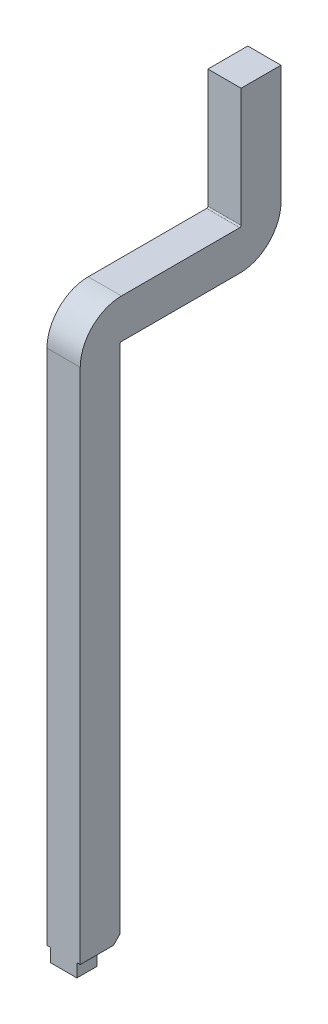
ISO-10303-21;
HEADER;
FILE_DESCRIPTION(('STEP AP214'),'2;1');
FILE_NAME('part.step','',(''),(''),'','','');
FILE_SCHEMA(('AUTOMOTIVE_DESIGN { 1 0 10303 214 1 1 1 1 }'));
ENDSEC;
DATA;
#1=APPLICATION_CONTEXT('core data for automotive mechanical design processes');
#2=APPLICATION_PROTOCOL_DEFINITION('international standard','automotive_design',2000,#1);
#3=PRODUCT_CONTEXT('',#1,'mechanical');
#4=PRODUCT('Part','Part','',(#3));
#5=PRODUCT_RELATED_PRODUCT_CATEGORY('part','',(#4));
#6=PRODUCT_DEFINITION_FORMATION('','',#4);
#7=PRODUCT_DEFINITION_CONTEXT('part definition',#1,'design');
#8=PRODUCT_DEFINITION('design','',#6,#7);
#9=PRODUCT_DEFINITION_SHAPE('','',#8);
#10=(LENGTH_UNIT() NAMED_UNIT(*) SI_UNIT(.MILLI.,.METRE.));
#11=(NAMED_UNIT(*) PLANE_ANGLE_UNIT() SI_UNIT($,.RADIAN.));
#12=(NAMED_UNIT(*) SI_UNIT($,.STERADIAN.) SOLID_ANGLE_UNIT());
#13=UNCERTAINTY_MEASURE_WITH_UNIT(LENGTH_MEASURE(1.E-05),#10,'distance_accuracy_value','');
#14=(GEOMETRIC_REPRESENTATION_CONTEXT(3) GLOBAL_UNCERTAINTY_ASSIGNED_CONTEXT((#13)) GLOBAL_UNIT_ASSIGNED_CONTEXT((#10,
#11,#12)) REPRESENTATION_CONTEXT('',''));
#15=CARTESIAN_POINT('',(0.,0.,0.));
#16=DIRECTION('',(0.,0.,1.));
#17=DIRECTION('',(1.,0.,0.));
#18=AXIS2_PLACEMENT_3D('',#15,#16,#17);
#19=CARTESIAN_POINT('',(0.,-2.04656537194598,0.));
#20=DIRECTION('',(0.,-1.,0.));
#21=DIRECTION('',(0.,0.,-1.));
#22=AXIS2_PLACEMENT_3D('',#19,#20,#21);
#23=PLANE('',#22);
#24=DIRECTION('',(1.,0.,0.));
#25=VECTOR('',#24,1.);
#26=CARTESIAN_POINT('',(-0.1,-2.04656537194598,0.604999999999999));
#27=LINE('',#26,#25);
#28=CARTESIAN_POINT('',(-0.1,-2.04656537194598,0.604999999999999));
#29=VERTEX_POINT('',#28);
#30=CARTESIAN_POINT('',(0.1,-2.04656537194598,0.604999999999999));
#31=VERTEX_POINT('',#30);
#32=EDGE_CURVE('E215',#29,#31,#27,.T.);
#33=ORIENTED_EDGE('',*,*,#32,.T.);
#34=DIRECTION('',(0.,0.,1.));
#35=VECTOR('',#34,1.);
#36=CARTESIAN_POINT('',(0.1,-2.04656537194598,0.604999999999999));
#37=LINE('',#36,#35);
#38=CARTESIAN_POINT('',(0.1,-2.04656537194598,0.754999999999999));
#39=VERTEX_POINT('',#38);
#40=EDGE_CURVE('E212',#31,#39,#37,.T.);
#41=ORIENTED_EDGE('',*,*,#40,.T.);
#42=DIRECTION('',(1.,0.,0.));
#43=VECTOR('',#42,1.);
#44=CARTESIAN_POINT('',(0.125,-2.04656537194598,0.754999999999999));
#45=LINE('',#44,#43);
#46=CARTESIAN_POINT('',(-0.1,-2.04656537194598,0.754999999999999));
#47=VERTEX_POINT('',#46);
#48=EDGE_CURVE('E173',#47,#39,#45,.T.);
#49=ORIENTED_EDGE('',*,*,#48,.F.);
#50=DIRECTION('',(0.,0.,-1.));
#51=VECTOR('',#50,1.);
#52=CARTESIAN_POINT('',(-0.1,-2.04656537194598,0.754999999999999));
#53=LINE('',#52,#51);
#54=EDGE_CURVE('E225',#47,#29,#53,.T.);
#55=ORIENTED_EDGE('',*,*,#54,.T.);
#56=EDGE_LOOP('',(#33,#41,#49,#55));
#57=FACE_BOUND('',#56,.T.);
#58=ADVANCED_FACE('F16',(#57),#23,.T.);
#59=CARTESIAN_POINT('',(-0.125,1.94343462805402,0.444999999999999));
#60=DIRECTION('',(-1.,0.,0.));
#61=DIRECTION('',(0.,0.,1.));
#62=AXIS2_PLACEMENT_3D('',#59,#60,#61);
#63=PLANE('',#62);
#64=DIRECTION('',(0.,0.,-1.));
#65=VECTOR('',#64,1.);
#66=CARTESIAN_POINT('',(-0.125,1.95656537194598,-0.445000000000001));
#67=LINE('',#66,#65);
#68=CARTESIAN_POINT('',(-0.125,1.95656537194598,0.445000000000001));
#69=VERTEX_POINT('',#68);
#70=CARTESIAN_POINT('',(-0.125,1.95656537194598,-0.445000000000001));
#71=VERTEX_POINT('',#70);
#72=EDGE_CURVE('E190',#69,#71,#67,.T.);
#73=ORIENTED_EDGE('',*,*,#72,.F.);
#74=CARTESIAN_POINT('',(-0.125,1.94656537194598,0.445000000000001));
#75=DIRECTION('',(-1.,0.,0.));
#76=DIRECTION('',(0.,0.,1.));
#77=AXIS2_PLACEMENT_3D('',#74,#75,#76);
#78=CIRCLE('',#77,0.01);
#79=CARTESIAN_POINT('',(-0.125,1.94656537194598,0.454999999999999));
#80=VERTEX_POINT('',#79);
#81=EDGE_CURVE('E183',#69,#80,#78,.F.);
#82=ORIENTED_EDGE('',*,*,#81,.T.);
#83=DIRECTION('',(0.,1.,0.));
#84=VECTOR('',#83,1.);
#85=CARTESIAN_POINT('',(-0.125,1.94656537194598,0.454999999999999));
#86=LINE('',#85,#84);
#87=CARTESIAN_POINT('',(-0.125,-1.89656537194598,0.455));
#88=VERTEX_POINT('',#87);
#89=EDGE_CURVE('E180',#88,#80,#86,.T.);
#90=ORIENTED_EDGE('',*,*,#89,.F.);
#91=DIRECTION('',(0.,-0.707106781186548,0.707106781186547));
#92=VECTOR('',#91,1.);
#93=CARTESIAN_POINT('',(-0.125,-1.89656537194598,0.454999999999999));
#94=LINE('',#93,#92);
#95=CARTESIAN_POINT('',(-0.125,-1.94656537194598,0.504999999999999));
#96=VERTEX_POINT('',#95);
#97=EDGE_CURVE('E186',#88,#96,#94,.T.);
#98=ORIENTED_EDGE('',*,*,#97,.T.);
#99=DIRECTION('',(0.,0.,1.));
#100=VECTOR('',#99,1.);
#101=CARTESIAN_POINT('',(-0.125,-1.94656537194598,0.444999999999999));
#102=LINE('',#101,#100);
#103=CARTESIAN_POINT('',(-0.125,-1.94656537194598,0.754999999999999));
#104=VERTEX_POINT('',#103);
#105=EDGE_CURVE('E148',#96,#104,#102,.T.);
#106=ORIENTED_EDGE('',*,*,#105,.T.);
#107=DIRECTION('',(0.,-1.,0.));
#108=VECTOR('',#107,1.);
#109=CARTESIAN_POINT('',(-0.125,-1.94656537194598,0.754999999999999));
#110=LINE('',#109,#108);
#111=CARTESIAN_POINT('',(-0.125,1.94343462805402,0.754999999999999));
#112=VERTEX_POINT('',#111);
#113=EDGE_CURVE('E146',#112,#104,#110,.T.);
#114=ORIENTED_EDGE('',*,*,#113,.F.);
#115=CARTESIAN_POINT('',(-0.125,1.94343462805402,0.444999999999999));
#116=DIRECTION('',(-1.,0.,0.));
#117=DIRECTION('',(0.,0.,1.));
#118=AXIS2_PLACEMENT_3D('',#115,#116,#117);
#119=CIRCLE('',#118,0.31);
#120=CARTESIAN_POINT('',(-0.125,2.25343462805402,0.444999999999999));
#121=VERTEX_POINT('',#120);
#122=EDGE_CURVE('E19',#121,#112,#119,.F.);
#123=ORIENTED_EDGE('',*,*,#122,.F.);
#124=DIRECTION('',(0.,0.,1.));
#125=VECTOR('',#124,1.);
#126=CARTESIAN_POINT('',(-0.125,2.25343462805402,0.444999999999999));
#127=LINE('',#126,#125);
#128=CARTESIAN_POINT('',(-0.125,2.25343462805402,-0.445000000000001));
#129=VERTEX_POINT('',#128);
#130=EDGE_CURVE('E131',#129,#121,#127,.T.);
#131=ORIENTED_EDGE('',*,*,#130,.F.);
#132=CARTESIAN_POINT('',(-0.125,2.26343462805402,-0.445000000000001));
#133=DIRECTION('',(-1.,0.,0.));
#134=DIRECTION('',(0.,0.,1.));
#135=AXIS2_PLACEMENT_3D('',#132,#133,#134);
#136=CIRCLE('',#135,0.01);
#137=CARTESIAN_POINT('',(-0.125,2.26343462805402,-0.454999999999998));
#138=VERTEX_POINT('',#137);
#139=EDGE_CURVE('E207',#129,#138,#136,.F.);
#140=ORIENTED_EDGE('',*,*,#139,.T.);
#141=DIRECTION('',(0.,1.,0.));
#142=VECTOR('',#141,1.);
#143=CARTESIAN_POINT('',(-0.125,2.26343462805402,-0.454999999999998));
#144=LINE('',#143,#142);
#145=CARTESIAN_POINT('',(-0.125,3.15656537194598,-0.454999999999998));
#146=VERTEX_POINT('',#145);
#147=EDGE_CURVE('E205',#146,#138,#144,.F.);
#148=ORIENTED_EDGE('',*,*,#147,.F.);
#149=DIRECTION('',(0.,0.,1.));
#150=VECTOR('',#149,1.);
#151=CARTESIAN_POINT('',(-0.125,3.15656537194598,-0.454999999999998));
#152=LINE('',#151,#150);
#153=CARTESIAN_POINT('',(-0.125,3.15656537194598,-0.754999999999998));
#154=VERTEX_POINT('',#153);
#155=EDGE_CURVE('E200',#154,#146,#152,.T.);
#156=ORIENTED_EDGE('',*,*,#155,.F.);
#157=DIRECTION('',(0.,1.,0.));
#158=VECTOR('',#157,1.);
#159=CARTESIAN_POINT('',(-0.125,3.15656537194598,-0.754999999999998));
#160=LINE('',#159,#158);
#161=CARTESIAN_POINT('',(-0.125,2.26656537194598,-0.754999999999999));
#162=VERTEX_POINT('',#161);
#163=EDGE_CURVE('E194',#162,#154,#160,.T.);
#164=ORIENTED_EDGE('',*,*,#163,.F.);
#165=CARTESIAN_POINT('',(-0.125,2.26656537194598,-0.445000000000001));
#166=DIRECTION('',(-1.,0.,0.));
#167=DIRECTION('',(0.,0.,1.));
#168=AXIS2_PLACEMENT_3D('',#165,#166,#167);
#169=CIRCLE('',#168,0.31);
#170=EDGE_CURVE('E277',#71,#162,#169,.F.);
#171=ORIENTED_EDGE('',*,*,#170,.F.);
#172=EDGE_LOOP('',(#73,#82,#90,#98,#106,#114,#123,#131,#140,#148,#156,#164,#171));
#173=FACE_BOUND('',#172,.T.);
#174=ADVANCED_FACE('F147',(#173),#63,.T.);
#175=CARTESIAN_POINT('',(0.1,-2.04656537194598,0.604999999999999));
#176=DIRECTION('',(-1.,0.,0.));
#177=DIRECTION('',(0.,0.,1.));
#178=AXIS2_PLACEMENT_3D('',#175,#176,#177);
#179=PLANE('',#178);
#180=DIRECTION('',(0.,-1.,0.));
#181=VECTOR('',#180,1.);
#182=CARTESIAN_POINT('',(0.1,-1.94656537194598,0.754999999999999));
#183=LINE('',#182,#181);
#184=CARTESIAN_POINT('',(0.1,-1.94656537194598,0.754999999999999));
#185=VERTEX_POINT('',#184);
#186=EDGE_CURVE('E144',#39,#185,#183,.F.);
#187=ORIENTED_EDGE('',*,*,#186,.F.);
#188=ORIENTED_EDGE('',*,*,#40,.F.);
#189=DIRECTION('',(0.,-1.,0.));
#190=VECTOR('',#189,1.);
#191=CARTESIAN_POINT('',(0.1,-2.04656537194598,0.604999999999999));
#192=LINE('',#191,#190);
#193=CARTESIAN_POINT('',(0.1,-1.94656537194598,0.604999999999999));
#194=VERTEX_POINT('',#193);
#195=EDGE_CURVE('E228',#31,#194,#192,.F.);
#196=ORIENTED_EDGE('',*,*,#195,.T.);
#197=DIRECTION('',(0.,0.,-1.));
#198=VECTOR('',#197,1.);
#199=CARTESIAN_POINT('',(0.1,-1.94656537194598,0.454999999999999));
#200=LINE('',#199,#198);
#201=EDGE_CURVE('E167',#185,#194,#200,.T.);
#202=ORIENTED_EDGE('',*,*,#201,.F.);
#203=EDGE_LOOP('',(#187,#188,#196,#202));
#204=FACE_BOUND('',#203,.T.);
#205=ADVANCED_FACE('F502',(#204),#179,.F.);
#206=CARTESIAN_POINT('',(-0.1,-2.04656537194598,0.604999999999999));
#207=DIRECTION('',(0.,0.,1.));
#208=DIRECTION('',(0.,-1.,0.));
#209=AXIS2_PLACEMENT_3D('',#206,#207,#208);
#210=PLANE('',#209);
#211=ORIENTED_EDGE('',*,*,#195,.F.);
#212=ORIENTED_EDGE('',*,*,#32,.F.);
#213=DIRECTION('',(0.,1.,0.));
#214=VECTOR('',#213,1.);
#215=CARTESIAN_POINT('',(-0.1,-2.04656537194598,0.604999999999999));
#216=LINE('',#215,#214);
#217=CARTESIAN_POINT('',(-0.1,-1.94656537194598,0.604999999999999));
#218=VERTEX_POINT('',#217);
#219=EDGE_CURVE('E153',#29,#218,#216,.T.);
#220=ORIENTED_EDGE('',*,*,#219,.T.);
#221=DIRECTION('',(1.,0.,0.));
#222=VECTOR('',#221,1.);
#223=CARTESIAN_POINT('',(0.125,-1.94656537194598,0.604999999999999));
#224=LINE('',#223,#222);
#225=EDGE_CURVE('E177',#194,#218,#224,.F.);
#226=ORIENTED_EDGE('',*,*,#225,.F.);
#227=EDGE_LOOP('',(#211,#212,#220,#226));
#228=FACE_BOUND('',#227,.T.);
#229=ADVANCED_FACE('F493',(#228),#210,.F.);
#230=CARTESIAN_POINT('',(-0.1,-2.04656537194598,0.754999999999999));
#231=DIRECTION('',(1.,0.,0.));
#232=DIRECTION('',(0.,0.,-1.));
#233=AXIS2_PLACEMENT_3D('',#230,#231,#232);
#234=PLANE('',#233);
#235=ORIENTED_EDGE('',*,*,#219,.F.);
#236=ORIENTED_EDGE('',*,*,#54,.F.);
#237=DIRECTION('',(0.,-1.,0.));
#238=VECTOR('',#237,1.);
#239=CARTESIAN_POINT('',(-0.1,-1.94656537194598,0.754999999999999));
#240=LINE('',#239,#238);
#241=CARTESIAN_POINT('',(-0.1,-1.94656537194598,0.754999999999999));
#242=VERTEX_POINT('',#241);
#243=EDGE_CURVE('E152',#242,#47,#240,.T.);
#244=ORIENTED_EDGE('',*,*,#243,.F.);
#245=DIRECTION('',(0.,0.,-1.));
#246=VECTOR('',#245,1.);
#247=CARTESIAN_POINT('',(-0.1,-1.94656537194598,0.454999999999999));
#248=LINE('',#247,#246);
#249=EDGE_CURVE('E231',#218,#242,#248,.F.);
#250=ORIENTED_EDGE('',*,*,#249,.F.);
#251=EDGE_LOOP('',(#235,#236,#244,#250));
#252=FACE_BOUND('',#251,.T.);
#253=ADVANCED_FACE('F485',(#252),#234,.F.);
#254=CARTESIAN_POINT('',(0.125,-1.94656537194598,0.754999999999999));
#255=DIRECTION('',(0.,0.,1.));
#256=DIRECTION('',(0.,-1.,0.));
#257=AXIS2_PLACEMENT_3D('',#254,#255,#256);
#258=PLANE('',#257);
#259=DIRECTION('',(0.,1.,0.));
#260=VECTOR('',#259,1.);
#261=CARTESIAN_POINT('',(0.125,1.94343462805402,0.754999999999999));
#262=LINE('',#261,#260);
#263=CARTESIAN_POINT('',(0.125,-1.94656537194598,0.754999999999999));
#264=VERTEX_POINT('',#263);
#265=CARTESIAN_POINT('',(0.125,1.94343462805402,0.754999999999999));
#266=VERTEX_POINT('',#265);
#267=EDGE_CURVE('E158',#264,#266,#262,.T.);
#268=ORIENTED_EDGE('',*,*,#267,.T.);
#269=DIRECTION('',(-1.,0.,0.));
#270=VECTOR('',#269,1.);
#271=CARTESIAN_POINT('',(0.125,1.94343462805402,0.754999999999999));
#272=LINE('',#271,#270);
#273=EDGE_CURVE('E140',#112,#266,#272,.F.);
#274=ORIENTED_EDGE('',*,*,#273,.F.);
#275=ORIENTED_EDGE('',*,*,#113,.T.);
#276=DIRECTION('',(1.,0.,0.));
#277=VECTOR('',#276,1.);
#278=CARTESIAN_POINT('',(0.125,-1.94656537194598,0.754999999999999));
#279=LINE('',#278,#277);
#280=EDGE_CURVE('E233',#242,#104,#279,.F.);
#281=ORIENTED_EDGE('',*,*,#280,.F.);
#282=ORIENTED_EDGE('',*,*,#243,.T.);
#283=ORIENTED_EDGE('',*,*,#48,.T.);
#284=ORIENTED_EDGE('',*,*,#186,.T.);
#285=DIRECTION('',(1.,0.,0.));
#286=VECTOR('',#285,1.);
#287=CARTESIAN_POINT('',(0.125,-1.94656537194598,0.754999999999999));
#288=LINE('',#287,#286);
#289=EDGE_CURVE('E164',#264,#185,#288,.F.);
#290=ORIENTED_EDGE('',*,*,#289,.F.);
#291=EDGE_LOOP('',(#268,#274,#275,#281,#282,#283,#284,#290));
#292=FACE_BOUND('',#291,.T.);
#293=ADVANCED_FACE('F156',(#292),#258,.T.);
#294=CARTESIAN_POINT('',(0.125,1.94343462805402,0.444999999999999));
#295=DIRECTION('',(-1.,0.,0.));
#296=DIRECTION('',(0.,0.,1.));
#297=AXIS2_PLACEMENT_3D('',#294,#295,#296);
#298=CYLINDRICAL_SURFACE('',#297,0.31);
#299=CARTESIAN_POINT('',(0.125,1.94343462805402,0.444999999999999));
#300=DIRECTION('',(-1.,0.,0.));
#301=DIRECTION('',(0.,0.,1.));
#302=AXIS2_PLACEMENT_3D('',#299,#300,#301);
#303=CIRCLE('',#302,0.31);
#304=CARTESIAN_POINT('',(0.125,2.25343462805402,0.444999999999999));
#305=VERTEX_POINT('',#304);
#306=EDGE_CURVE('E272',#266,#305,#303,.T.);
#307=ORIENTED_EDGE('',*,*,#306,.T.);
#308=DIRECTION('',(1.,0.,0.));
#309=VECTOR('',#308,1.);
#310=CARTESIAN_POINT('',(0.125,2.25343462805402,0.444999999999999));
#311=LINE('',#310,#309);
#312=EDGE_CURVE('E142',#121,#305,#311,.T.);
#313=ORIENTED_EDGE('',*,*,#312,.F.);
#314=ORIENTED_EDGE('',*,*,#122,.T.);
#315=ORIENTED_EDGE('',*,*,#273,.T.);
#316=EDGE_LOOP('',(#307,#313,#314,#315));
#317=FACE_BOUND('',#316,.T.);
#318=ADVANCED_FACE('F138',(#317),#298,.T.);
#319=CARTESIAN_POINT('',(0.125,2.25343462805402,0.444999999999999));
#320=DIRECTION('',(0.,1.,0.));
#321=DIRECTION('',(0.,0.,1.));
#322=AXIS2_PLACEMENT_3D('',#319,#320,#321);
#323=PLANE('',#322);
#324=DIRECTION('',(0.,0.,1.));
#325=VECTOR('',#324,1.);
#326=CARTESIAN_POINT('',(0.125,2.25343462805402,0.444999999999999));
#327=LINE('',#326,#325);
#328=CARTESIAN_POINT('',(0.125,2.25343462805402,-0.445000000000001));
#329=VERTEX_POINT('',#328);
#330=EDGE_CURVE('E271',#305,#329,#327,.F.);
#331=ORIENTED_EDGE('',*,*,#330,.T.);
#332=DIRECTION('',(-1.,0.,0.));
#333=VECTOR('',#332,1.);
#334=CARTESIAN_POINT('',(0.125,2.25343462805402,-0.445000000000001));
#335=LINE('',#334,#333);
#336=EDGE_CURVE('E279',#329,#129,#335,.T.);
#337=ORIENTED_EDGE('',*,*,#336,.T.);
#338=ORIENTED_EDGE('',*,*,#130,.T.);
#339=ORIENTED_EDGE('',*,*,#312,.T.);
#340=EDGE_LOOP('',(#331,#337,#338,#339));
#341=FACE_BOUND('',#340,.T.);
#342=ADVANCED_FACE('F366',(#341),#323,.T.);
#343=CARTESIAN_POINT('',(0.125,2.26343462805402,-0.445000000000001));
#344=DIRECTION('',(-1.,0.,0.));
#345=DIRECTION('',(0.,0.,1.));
#346=AXIS2_PLACEMENT_3D('',#343,#344,#345);
#347=CYLINDRICAL_SURFACE('',#346,0.01);
#348=ORIENTED_EDGE('',*,*,#336,.F.);
#349=CARTESIAN_POINT('',(0.125,2.26343462805402,-0.445000000000001));
#350=DIRECTION('',(-1.,0.,0.));
#351=DIRECTION('',(0.,0.,1.));
#352=AXIS2_PLACEMENT_3D('',#349,#350,#351);
#353=CIRCLE('',#352,0.01);
#354=CARTESIAN_POINT('',(0.125,2.26343462805402,-0.455));
#355=VERTEX_POINT('',#354);
#356=EDGE_CURVE('E267',#329,#355,#353,.F.);
#357=ORIENTED_EDGE('',*,*,#356,.T.);
#358=DIRECTION('',(1.,0.,0.));
#359=VECTOR('',#358,1.);
#360=CARTESIAN_POINT('',(0.125,2.26343462805402,-0.454999999999998));
#361=LINE('',#360,#359);
#362=EDGE_CURVE('E202',#138,#355,#361,.T.);
#363=ORIENTED_EDGE('',*,*,#362,.F.);
#364=ORIENTED_EDGE('',*,*,#139,.F.);
#365=EDGE_LOOP('',(#348,#357,#363,#364));
#366=FACE_BOUND('',#365,.T.);
#367=ADVANCED_FACE('F364',(#366),#347,.F.);
#368=CARTESIAN_POINT('',(0.125,2.26343462805402,-0.454999999999998));
#369=DIRECTION('',(0.,0.,1.));
#370=DIRECTION('',(1.,0.,0.));
#371=AXIS2_PLACEMENT_3D('',#368,#369,#370);
#372=PLANE('',#371);
#373=DIRECTION('',(0.,1.,0.));
#374=VECTOR('',#373,1.);
#375=CARTESIAN_POINT('',(0.125,1.94343462805402,-0.455000000000001));
#376=LINE('',#375,#374);
#377=CARTESIAN_POINT('',(0.125,3.15656537194598,-0.455));
#378=VERTEX_POINT('',#377);
#379=EDGE_CURVE('E270',#355,#378,#376,.T.);
#380=ORIENTED_EDGE('',*,*,#379,.T.);
#381=DIRECTION('',(1.,0.,0.));
#382=VECTOR('',#381,1.);
#383=CARTESIAN_POINT('',(0.125,3.15656537194598,-0.454999999999998));
#384=LINE('',#383,#382);
#385=EDGE_CURVE('E197',#146,#378,#384,.T.);
#386=ORIENTED_EDGE('',*,*,#385,.F.);
#387=ORIENTED_EDGE('',*,*,#147,.T.);
#388=ORIENTED_EDGE('',*,*,#362,.T.);
#389=EDGE_LOOP('',(#380,#386,#387,#388));
#390=FACE_BOUND('',#389,.T.);
#391=ADVANCED_FACE('F360',(#390),#372,.T.);
#392=CARTESIAN_POINT('',(0.125,3.15656537194598,-0.454999999999998));
#393=DIRECTION('',(0.,1.,0.));
#394=DIRECTION('',(0.,0.,1.));
#395=AXIS2_PLACEMENT_3D('',#392,#393,#394);
#396=PLANE('',#395);
#397=DIRECTION('',(0.,0.,1.));
#398=VECTOR('',#397,1.);
#399=CARTESIAN_POINT('',(0.125,3.15656537194598,0.444999999999999));
#400=LINE('',#399,#398);
#401=CARTESIAN_POINT('',(0.125,3.15656537194598,-0.754999999999998));
#402=VERTEX_POINT('',#401);
#403=EDGE_CURVE('E291',#378,#402,#400,.F.);
#404=ORIENTED_EDGE('',*,*,#403,.T.);
#405=DIRECTION('',(-1.,0.,0.));
#406=VECTOR('',#405,1.);
#407=CARTESIAN_POINT('',(0.125,3.15656537194598,-0.754999999999998));
#408=LINE('',#407,#406);
#409=EDGE_CURVE('E196',#154,#402,#408,.F.);
#410=ORIENTED_EDGE('',*,*,#409,.F.);
#411=ORIENTED_EDGE('',*,*,#155,.T.);
#412=ORIENTED_EDGE('',*,*,#385,.T.);
#413=EDGE_LOOP('',(#404,#410,#411,#412));
#414=FACE_BOUND('',#413,.T.);
#415=ADVANCED_FACE('F357',(#414),#396,.T.);
#416=CARTESIAN_POINT('',(0.125,3.15656537194598,-0.754999999999998));
#417=DIRECTION('',(0.,0.,-1.));
#418=DIRECTION('',(-1.,0.,0.));
#419=AXIS2_PLACEMENT_3D('',#416,#417,#418);
#420=PLANE('',#419);
#421=DIRECTION('',(0.,1.,0.));
#422=VECTOR('',#421,1.);
#423=CARTESIAN_POINT('',(0.125,1.94343462805402,-0.754999999999998));
#424=LINE('',#423,#422);
#425=CARTESIAN_POINT('',(0.125,2.26656537194598,-0.755));
#426=VERTEX_POINT('',#425);
#427=EDGE_CURVE('E266',#402,#426,#424,.F.);
#428=ORIENTED_EDGE('',*,*,#427,.T.);
#429=DIRECTION('',(-1.,0.,0.));
#430=VECTOR('',#429,1.);
#431=CARTESIAN_POINT('',(0.125,2.26656537194598,-0.755000000000001));
#432=LINE('',#431,#430);
#433=EDGE_CURVE('E193',#162,#426,#432,.F.);
#434=ORIENTED_EDGE('',*,*,#433,.F.);
#435=ORIENTED_EDGE('',*,*,#163,.T.);
#436=ORIENTED_EDGE('',*,*,#409,.T.);
#437=EDGE_LOOP('',(#428,#434,#435,#436));
#438=FACE_BOUND('',#437,.T.);
#439=ADVANCED_FACE('F351',(#438),#420,.T.);
#440=CARTESIAN_POINT('',(0.125,2.26656537194598,-0.445000000000001));
#441=DIRECTION('',(-1.,0.,0.));
#442=DIRECTION('',(0.,0.,1.));
#443=AXIS2_PLACEMENT_3D('',#440,#441,#442);
#444=CYLINDRICAL_SURFACE('',#443,0.31);
#445=CARTESIAN_POINT('',(0.125,2.26656537194598,-0.445000000000001));
#446=DIRECTION('',(-1.,0.,0.));
#447=DIRECTION('',(0.,0.,1.));
#448=AXIS2_PLACEMENT_3D('',#445,#446,#447);
#449=CIRCLE('',#448,0.31);
#450=CARTESIAN_POINT('',(0.125,1.95656537194598,-0.445000000000001));
#451=VERTEX_POINT('',#450);
#452=EDGE_CURVE('E263',#426,#451,#449,.T.);
#453=ORIENTED_EDGE('',*,*,#452,.T.);
#454=DIRECTION('',(1.,0.,0.));
#455=VECTOR('',#454,1.);
#456=CARTESIAN_POINT('',(0.125,1.95656537194598,-0.445000000000001));
#457=LINE('',#456,#455);
#458=EDGE_CURVE('E192',#71,#451,#457,.T.);
#459=ORIENTED_EDGE('',*,*,#458,.F.);
#460=ORIENTED_EDGE('',*,*,#170,.T.);
#461=ORIENTED_EDGE('',*,*,#433,.T.);
#462=EDGE_LOOP('',(#453,#459,#460,#461));
#463=FACE_BOUND('',#462,.T.);
#464=ADVANCED_FACE('F347',(#463),#444,.T.);
#465=CARTESIAN_POINT('',(0.125,1.95656537194598,-0.445000000000001));
#466=DIRECTION('',(0.,-1.,0.));
#467=DIRECTION('',(0.,0.,-1.));
#468=AXIS2_PLACEMENT_3D('',#465,#466,#467);
#469=PLANE('',#468);
#470=DIRECTION('',(0.,0.,1.));
#471=VECTOR('',#470,1.);
#472=CARTESIAN_POINT('',(0.125,1.95656537194598,0.444999999999999));
#473=LINE('',#472,#471);
#474=CARTESIAN_POINT('',(0.125,1.95656537194598,0.445000000000001));
#475=VERTEX_POINT('',#474);
#476=EDGE_CURVE('E262',#451,#475,#473,.T.);
#477=ORIENTED_EDGE('',*,*,#476,.T.);
#478=DIRECTION('',(-1.,0.,0.));
#479=VECTOR('',#478,1.);
#480=CARTESIAN_POINT('',(0.125,1.95656537194598,0.445000000000001));
#481=LINE('',#480,#479);
#482=EDGE_CURVE('E276',#475,#69,#481,.T.);
#483=ORIENTED_EDGE('',*,*,#482,.T.);
#484=ORIENTED_EDGE('',*,*,#72,.T.);
#485=ORIENTED_EDGE('',*,*,#458,.T.);
#486=EDGE_LOOP('',(#477,#483,#484,#485));
#487=FACE_BOUND('',#486,.T.);
#488=ADVANCED_FACE('F341',(#487),#469,.T.);
#489=CARTESIAN_POINT('',(0.125,1.94656537194598,0.445000000000001));
#490=DIRECTION('',(-1.,0.,0.));
#491=DIRECTION('',(0.,0.,1.));
#492=AXIS2_PLACEMENT_3D('',#489,#490,#491);
#493=CYLINDRICAL_SURFACE('',#492,0.01);
#494=ORIENTED_EDGE('',*,*,#482,.F.);
#495=CARTESIAN_POINT('',(0.125,1.94656537194598,0.445000000000001));
#496=DIRECTION('',(-1.,0.,0.));
#497=DIRECTION('',(0.,0.,1.));
#498=AXIS2_PLACEMENT_3D('',#495,#496,#497);
#499=CIRCLE('',#498,0.01);
#500=CARTESIAN_POINT('',(0.125,1.94656537194598,0.455));
#501=VERTEX_POINT('',#500);
#502=EDGE_CURVE('E258',#475,#501,#499,.F.);
#503=ORIENTED_EDGE('',*,*,#502,.T.);
#504=DIRECTION('',(-1.,0.,0.));
#505=VECTOR('',#504,1.);
#506=CARTESIAN_POINT('',(0.125,1.94656537194598,0.454999999999999));
#507=LINE('',#506,#505);
#508=EDGE_CURVE('E182',#80,#501,#507,.F.);
#509=ORIENTED_EDGE('',*,*,#508,.F.);
#510=ORIENTED_EDGE('',*,*,#81,.F.);
#511=EDGE_LOOP('',(#494,#503,#509,#510));
#512=FACE_BOUND('',#511,.T.);
#513=ADVANCED_FACE('F338',(#512),#493,.F.);
#514=CARTESIAN_POINT('',(0.125,1.94656537194598,0.454999999999999));
#515=DIRECTION('',(0.,0.,-1.));
#516=DIRECTION('',(-1.,0.,0.));
#517=AXIS2_PLACEMENT_3D('',#514,#515,#516);
#518=PLANE('',#517);
#519=ORIENTED_EDGE('',*,*,#89,.T.);
#520=ORIENTED_EDGE('',*,*,#508,.T.);
#521=DIRECTION('',(0.,1.,0.));
#522=VECTOR('',#521,1.);
#523=CARTESIAN_POINT('',(0.125,1.94343462805402,0.455000000000001));
#524=LINE('',#523,#522);
#525=CARTESIAN_POINT('',(0.125,-1.89656537194598,0.455000000000001));
#526=VERTEX_POINT('',#525);
#527=EDGE_CURVE('E261',#501,#526,#524,.F.);
#528=ORIENTED_EDGE('',*,*,#527,.T.);
#529=DIRECTION('',(1.,0.,0.));
#530=VECTOR('',#529,1.);
#531=CARTESIAN_POINT('',(0.125,-1.89656537194598,0.454999999999999));
#532=LINE('',#531,#530);
#533=EDGE_CURVE('E255',#526,#88,#532,.F.);
#534=ORIENTED_EDGE('',*,*,#533,.T.);
#535=EDGE_LOOP('',(#519,#520,#528,#534));
#536=FACE_BOUND('',#535,.T.);
#537=ADVANCED_FACE('F330',(#536),#518,.T.);
#538=CARTESIAN_POINT('',(0.125,-1.89656537194598,0.454999999999999));
#539=DIRECTION('',(0.,0.707106781186546,0.707106781186549));
#540=DIRECTION('',(0.,-0.707106781186549,0.707106781186546));
#541=AXIS2_PLACEMENT_3D('',#538,#539,#540);
#542=PLANE('',#541);
#543=DIRECTION('',(1.,0.,0.));
#544=VECTOR('',#543,1.);
#545=CARTESIAN_POINT('',(0.125,-1.94656537194598,0.504999999999999));
#546=LINE('',#545,#544);
#547=CARTESIAN_POINT('',(0.125,-1.94656537194598,0.504999999999999));
#548=VERTEX_POINT('',#547);
#549=EDGE_CURVE('E33',#96,#548,#546,.T.);
#550=ORIENTED_EDGE('',*,*,#549,.F.);
#551=ORIENTED_EDGE('',*,*,#97,.F.);
#552=ORIENTED_EDGE('',*,*,#533,.F.);
#553=DIRECTION('',(0.,-0.707106781186548,0.707106781186547));
#554=VECTOR('',#553,1.);
#555=CARTESIAN_POINT('',(0.125,-1.89656537194598,0.454999999999999));
#556=LINE('',#555,#554);
#557=EDGE_CURVE('E25',#526,#548,#556,.T.);
#558=ORIENTED_EDGE('',*,*,#557,.T.);
#559=EDGE_LOOP('',(#550,#551,#552,#558));
#560=FACE_BOUND('',#559,.T.);
#561=ADVANCED_FACE('F381',(#560),#542,.F.);
#562=CARTESIAN_POINT('',(0.125,-1.94656537194598,0.454999999999999));
#563=DIRECTION('',(0.,-1.,0.));
#564=DIRECTION('',(0.,0.,-1.));
#565=AXIS2_PLACEMENT_3D('',#562,#563,#564);
#566=PLANE('',#565);
#567=ORIENTED_EDGE('',*,*,#249,.T.);
#568=ORIENTED_EDGE('',*,*,#280,.T.);
#569=ORIENTED_EDGE('',*,*,#105,.F.);
#570=ORIENTED_EDGE('',*,*,#549,.T.);
#571=DIRECTION('',(0.,0.,1.));
#572=VECTOR('',#571,1.);
#573=CARTESIAN_POINT('',(0.125,-1.94656537194598,0.444999999999999));
#574=LINE('',#573,#572);
#575=EDGE_CURVE('E11',#548,#264,#574,.T.);
#576=ORIENTED_EDGE('',*,*,#575,.T.);
#577=ORIENTED_EDGE('',*,*,#289,.T.);
#578=ORIENTED_EDGE('',*,*,#201,.T.);
#579=ORIENTED_EDGE('',*,*,#225,.T.);
#580=EDGE_LOOP('',(#567,#568,#569,#570,#576,#577,#578,#579));
#581=FACE_BOUND('',#580,.T.);
#582=ADVANCED_FACE('F376',(#581),#566,.T.);
#583=CARTESIAN_POINT('',(0.125,1.94343462805402,0.444999999999999));
#584=DIRECTION('',(-1.,0.,0.));
#585=DIRECTION('',(0.,0.,1.));
#586=AXIS2_PLACEMENT_3D('',#583,#584,#585);
#587=PLANE('',#586);
#588=ORIENTED_EDGE('',*,*,#557,.F.);
#589=ORIENTED_EDGE('',*,*,#527,.F.);
#590=ORIENTED_EDGE('',*,*,#502,.F.);
#591=ORIENTED_EDGE('',*,*,#476,.F.);
#592=ORIENTED_EDGE('',*,*,#452,.F.);
#593=ORIENTED_EDGE('',*,*,#427,.F.);
#594=ORIENTED_EDGE('',*,*,#403,.F.);
#595=ORIENTED_EDGE('',*,*,#379,.F.);
#596=ORIENTED_EDGE('',*,*,#356,.F.);
#597=ORIENTED_EDGE('',*,*,#330,.F.);
#598=ORIENTED_EDGE('',*,*,#306,.F.);
#599=ORIENTED_EDGE('',*,*,#267,.F.);
#600=ORIENTED_EDGE('',*,*,#575,.F.);
#601=EDGE_LOOP('',(#588,#589,#590,#591,#592,#593,#594,#595,#596,#597,#598,#599,#600));
#602=FACE_BOUND('',#601,.T.);
#603=ADVANCED_FACE('F335',(#602),#587,.F.);
#604=CLOSED_SHELL('',(#58,#174,#205,#229,#253,#293,#318,#342,#367,#391,#415,#439,#464,#488,#513,
#537,#561,#582,#603));
#605=MANIFOLD_SOLID_BREP('B1',#604);
#606=ADVANCED_BREP_SHAPE_REPRESENTATION('',(#18,#605),#14);
#607=SHAPE_DEFINITION_REPRESENTATION(#9,#606);
ENDSEC;
END-ISO-10303-21;
